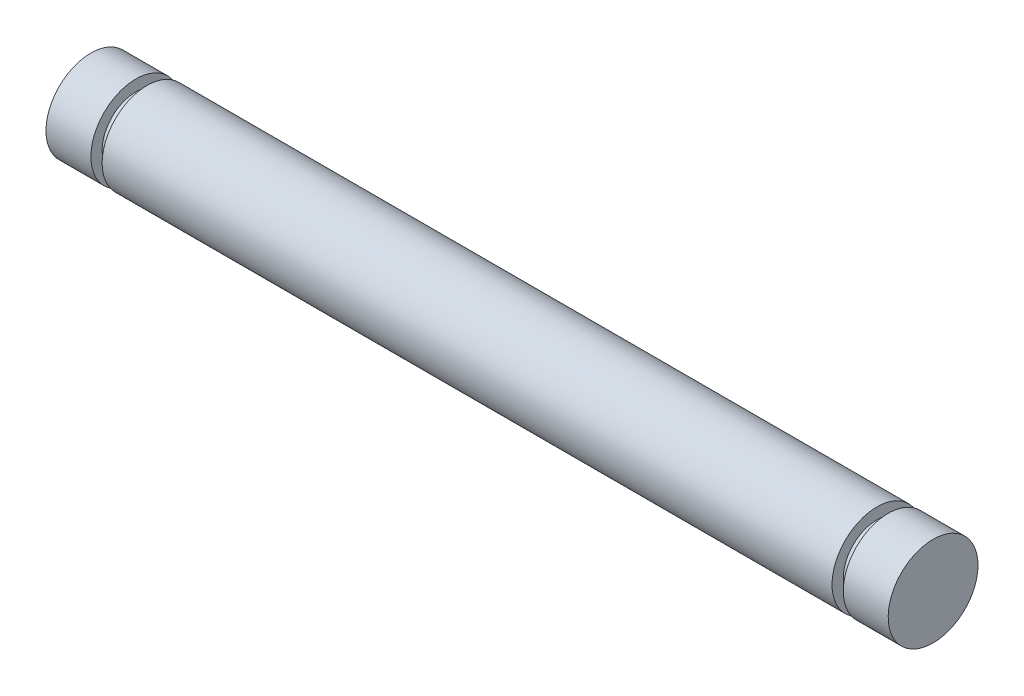
ISO-10303-21;
HEADER;
FILE_DESCRIPTION(('STEP AP214'),'2;1');
FILE_NAME('part.step','',(''),(''),'','','');
FILE_SCHEMA(('AUTOMOTIVE_DESIGN { 1 0 10303 214 1 1 1 1 }'));
ENDSEC;
DATA;
#1=APPLICATION_CONTEXT('core data for automotive mechanical design processes');
#2=APPLICATION_PROTOCOL_DEFINITION('international standard','automotive_design',2000,#1);
#3=PRODUCT_CONTEXT('',#1,'mechanical');
#4=PRODUCT('Part','Part','',(#3));
#5=PRODUCT_RELATED_PRODUCT_CATEGORY('part','',(#4));
#6=PRODUCT_DEFINITION_FORMATION('','',#4);
#7=PRODUCT_DEFINITION_CONTEXT('part definition',#1,'design');
#8=PRODUCT_DEFINITION('design','',#6,#7);
#9=PRODUCT_DEFINITION_SHAPE('','',#8);
#10=(LENGTH_UNIT() NAMED_UNIT(*) SI_UNIT(.MILLI.,.METRE.));
#11=(NAMED_UNIT(*) PLANE_ANGLE_UNIT() SI_UNIT($,.RADIAN.));
#12=(NAMED_UNIT(*) SI_UNIT($,.STERADIAN.) SOLID_ANGLE_UNIT());
#13=UNCERTAINTY_MEASURE_WITH_UNIT(LENGTH_MEASURE(1.E-05),#10,'distance_accuracy_value','');
#14=(GEOMETRIC_REPRESENTATION_CONTEXT(3) GLOBAL_UNCERTAINTY_ASSIGNED_CONTEXT((#13)) GLOBAL_UNIT_ASSIGNED_CONTEXT((#10,
#11,#12)) REPRESENTATION_CONTEXT('',''));
#15=CARTESIAN_POINT('',(0.,0.,0.));
#16=DIRECTION('',(0.,0.,1.));
#17=DIRECTION('',(1.,0.,0.));
#18=AXIS2_PLACEMENT_3D('',#15,#16,#17);
#19=CARTESIAN_POINT('',(-37.5,0.,0.));
#20=DIRECTION('',(1.,0.,0.));
#21=DIRECTION('',(0.,1.,0.));
#22=AXIS2_PLACEMENT_3D('',#19,#20,#21);
#23=PLANE('',#22);
#24=CARTESIAN_POINT('',(-37.5,0.,0.));
#25=DIRECTION('',(-1.,0.,0.));
#26=DIRECTION('',(0.,-1.,0.));
#27=AXIS2_PLACEMENT_3D('',#24,#25,#26);
#28=CIRCLE('',#27,4.);
#29=CARTESIAN_POINT('',(-37.5,-4.,0.));
#30=VERTEX_POINT('',#29);
#31=EDGE_CURVE('E10',#30,#30,#28,.T.);
#32=ORIENTED_EDGE('',*,*,#31,.T.);
#33=EDGE_LOOP('',(#32));
#34=FACE_BOUND('',#33,.T.);
#35=ADVANCED_FACE('F31',(#34),#23,.F.);
#36=CARTESIAN_POINT('',(-37.5,0.,0.));
#37=DIRECTION('',(-1.,0.,0.));
#38=DIRECTION('',(0.,-1.,0.));
#39=AXIS2_PLACEMENT_3D('',#36,#37,#38);
#40=CYLINDRICAL_SURFACE('',#39,4.);
#41=ORIENTED_EDGE('',*,*,#31,.F.);
#42=EDGE_LOOP('',(#41));
#43=FACE_BOUND('',#42,.T.);
#44=CARTESIAN_POINT('',(-33.5,0.,0.));
#45=DIRECTION('',(-1.,0.,0.));
#46=DIRECTION('',(0.,-1.,0.));
#47=AXIS2_PLACEMENT_3D('',#44,#45,#46);
#48=CIRCLE('',#47,4.);
#49=CARTESIAN_POINT('',(-33.5,-4.,0.));
#50=VERTEX_POINT('',#49);
#51=EDGE_CURVE('E37',#50,#50,#48,.T.);
#52=ORIENTED_EDGE('',*,*,#51,.T.);
#53=EDGE_LOOP('',(#52));
#54=FACE_BOUND('',#53,.T.);
#55=ADVANCED_FACE('F81',(#43,#54),#40,.T.);
#56=CARTESIAN_POINT('',(-33.5,4.,0.));
#57=DIRECTION('',(-1.,0.,0.));
#58=DIRECTION('',(0.,-1.,0.));
#59=AXIS2_PLACEMENT_3D('',#56,#57,#58);
#60=PLANE('',#59);
#61=ORIENTED_EDGE('',*,*,#51,.F.);
#62=EDGE_LOOP('',(#61));
#63=FACE_BOUND('',#62,.T.);
#64=CARTESIAN_POINT('',(-33.5,0.,0.));
#65=DIRECTION('',(-1.,0.,0.));
#66=DIRECTION('',(0.,-1.,0.));
#67=AXIS2_PLACEMENT_3D('',#64,#65,#66);
#68=CIRCLE('',#67,3.);
#69=CARTESIAN_POINT('',(-33.5,-3.,0.));
#70=VERTEX_POINT('',#69);
#71=EDGE_CURVE('E41',#70,#70,#68,.T.);
#72=ORIENTED_EDGE('',*,*,#71,.T.);
#73=EDGE_LOOP('',(#72));
#74=FACE_BOUND('',#73,.T.);
#75=ADVANCED_FACE('F85',(#63,#74),#60,.F.);
#76=CARTESIAN_POINT('',(-37.5,0.,0.));
#77=DIRECTION('',(-1.,0.,0.));
#78=DIRECTION('',(0.,-1.,0.));
#79=AXIS2_PLACEMENT_3D('',#76,#77,#78);
#80=CYLINDRICAL_SURFACE('',#79,3.);
#81=ORIENTED_EDGE('',*,*,#71,.F.);
#82=EDGE_LOOP('',(#81));
#83=FACE_BOUND('',#82,.T.);
#84=CARTESIAN_POINT('',(-32.5,0.,0.));
#85=DIRECTION('',(-1.,0.,0.));
#86=DIRECTION('',(0.,-1.,0.));
#87=AXIS2_PLACEMENT_3D('',#84,#85,#86);
#88=CIRCLE('',#87,3.);
#89=CARTESIAN_POINT('',(-32.5,-3.,0.));
#90=VERTEX_POINT('',#89);
#91=EDGE_CURVE('E45',#90,#90,#88,.T.);
#92=ORIENTED_EDGE('',*,*,#91,.T.);
#93=EDGE_LOOP('',(#92));
#94=FACE_BOUND('',#93,.T.);
#95=ADVANCED_FACE('F90',(#83,#94),#80,.T.);
#96=CARTESIAN_POINT('',(-32.5,3.,0.));
#97=DIRECTION('',(1.,0.,0.));
#98=DIRECTION('',(0.,1.,0.));
#99=AXIS2_PLACEMENT_3D('',#96,#97,#98);
#100=PLANE('',#99);
#101=ORIENTED_EDGE('',*,*,#91,.F.);
#102=EDGE_LOOP('',(#101));
#103=FACE_BOUND('',#102,.T.);
#104=CARTESIAN_POINT('',(-32.5,0.,0.));
#105=DIRECTION('',(-1.,0.,0.));
#106=DIRECTION('',(0.,-1.,0.));
#107=AXIS2_PLACEMENT_3D('',#104,#105,#106);
#108=CIRCLE('',#107,4.);
#109=CARTESIAN_POINT('',(-32.5,-4.,0.));
#110=VERTEX_POINT('',#109);
#111=EDGE_CURVE('E50',#110,#110,#108,.T.);
#112=ORIENTED_EDGE('',*,*,#111,.T.);
#113=EDGE_LOOP('',(#112));
#114=FACE_BOUND('',#113,.T.);
#115=ADVANCED_FACE('F96',(#103,#114),#100,.F.);
#116=CARTESIAN_POINT('',(-37.5,0.,0.));
#117=DIRECTION('',(-1.,0.,0.));
#118=DIRECTION('',(0.,-1.,0.));
#119=AXIS2_PLACEMENT_3D('',#116,#117,#118);
#120=CYLINDRICAL_SURFACE('',#119,3.99999999999999);
#121=ORIENTED_EDGE('',*,*,#111,.F.);
#122=EDGE_LOOP('',(#121));
#123=FACE_BOUND('',#122,.T.);
#124=CARTESIAN_POINT('',(32.5,0.,0.));
#125=DIRECTION('',(-1.,0.,0.));
#126=DIRECTION('',(0.,-1.,0.));
#127=AXIS2_PLACEMENT_3D('',#124,#125,#126);
#128=CIRCLE('',#127,3.99999999999999);
#129=CARTESIAN_POINT('',(32.5,-3.99999999999997,0.));
#130=VERTEX_POINT('',#129);
#131=EDGE_CURVE('E53',#130,#130,#128,.T.);
#132=ORIENTED_EDGE('',*,*,#131,.T.);
#133=EDGE_LOOP('',(#132));
#134=FACE_BOUND('',#133,.T.);
#135=ADVANCED_FACE('F100',(#123,#134),#120,.T.);
#136=CARTESIAN_POINT('',(32.5,4.,0.));
#137=DIRECTION('',(-1.,0.,0.));
#138=DIRECTION('',(0.,-1.,0.));
#139=AXIS2_PLACEMENT_3D('',#136,#137,#138);
#140=PLANE('',#139);
#141=ORIENTED_EDGE('',*,*,#131,.F.);
#142=EDGE_LOOP('',(#141));
#143=FACE_BOUND('',#142,.T.);
#144=CARTESIAN_POINT('',(32.5,0.,0.));
#145=DIRECTION('',(-1.,0.,0.));
#146=DIRECTION('',(0.,-1.,0.));
#147=AXIS2_PLACEMENT_3D('',#144,#145,#146);
#148=CIRCLE('',#147,2.99999999999999);
#149=CARTESIAN_POINT('',(32.5,-2.99999999999997,0.));
#150=VERTEX_POINT('',#149);
#151=EDGE_CURVE('E56',#150,#150,#148,.T.);
#152=ORIENTED_EDGE('',*,*,#151,.T.);
#153=EDGE_LOOP('',(#152));
#154=FACE_BOUND('',#153,.T.);
#155=ADVANCED_FACE('F104',(#143,#154),#140,.F.);
#156=CARTESIAN_POINT('',(-37.5,0.,0.));
#157=DIRECTION('',(-1.,0.,0.));
#158=DIRECTION('',(0.,-1.,0.));
#159=AXIS2_PLACEMENT_3D('',#156,#157,#158);
#160=CYLINDRICAL_SURFACE('',#159,2.99999999999999);
#161=ORIENTED_EDGE('',*,*,#151,.F.);
#162=EDGE_LOOP('',(#161));
#163=FACE_BOUND('',#162,.T.);
#164=CARTESIAN_POINT('',(33.5,0.,0.));
#165=DIRECTION('',(-1.,0.,0.));
#166=DIRECTION('',(0.,-1.,0.));
#167=AXIS2_PLACEMENT_3D('',#164,#165,#166);
#168=CIRCLE('',#167,3.);
#169=CARTESIAN_POINT('',(33.5,-2.99999999999999,0.));
#170=VERTEX_POINT('',#169);
#171=EDGE_CURVE('E59',#170,#170,#168,.T.);
#172=ORIENTED_EDGE('',*,*,#171,.T.);
#173=EDGE_LOOP('',(#172));
#174=FACE_BOUND('',#173,.T.);
#175=ADVANCED_FACE('F108',(#163,#174),#160,.T.);
#176=CARTESIAN_POINT('',(33.5,3.00000000000001,0.));
#177=DIRECTION('',(1.,0.,0.));
#178=DIRECTION('',(0.,1.,0.));
#179=AXIS2_PLACEMENT_3D('',#176,#177,#178);
#180=PLANE('',#179);
#181=ORIENTED_EDGE('',*,*,#171,.F.);
#182=EDGE_LOOP('',(#181));
#183=FACE_BOUND('',#182,.T.);
#184=CARTESIAN_POINT('',(33.5,0.,0.));
#185=DIRECTION('',(-1.,0.,0.));
#186=DIRECTION('',(0.,-1.,0.));
#187=AXIS2_PLACEMENT_3D('',#184,#185,#186);
#188=CIRCLE('',#187,4.);
#189=CARTESIAN_POINT('',(33.5,-3.99999999999999,0.));
#190=VERTEX_POINT('',#189);
#191=EDGE_CURVE('E62',#190,#190,#188,.T.);
#192=ORIENTED_EDGE('',*,*,#191,.T.);
#193=EDGE_LOOP('',(#192));
#194=FACE_BOUND('',#193,.T.);
#195=ADVANCED_FACE('F77',(#183,#194),#180,.F.);
#196=CARTESIAN_POINT('',(-37.5,0.,0.));
#197=DIRECTION('',(-1.,0.,0.));
#198=DIRECTION('',(0.,-1.,0.));
#199=AXIS2_PLACEMENT_3D('',#196,#197,#198);
#200=CYLINDRICAL_SURFACE('',#199,4.);
#201=ORIENTED_EDGE('',*,*,#191,.F.);
#202=EDGE_LOOP('',(#201));
#203=FACE_BOUND('',#202,.T.);
#204=CARTESIAN_POINT('',(37.5,0.,0.));
#205=DIRECTION('',(-1.,0.,0.));
#206=DIRECTION('',(0.,-1.,0.));
#207=AXIS2_PLACEMENT_3D('',#204,#205,#206);
#208=CIRCLE('',#207,4.);
#209=CARTESIAN_POINT('',(37.5,-3.99999999999999,0.));
#210=VERTEX_POINT('',#209);
#211=EDGE_CURVE('E65',#210,#210,#208,.T.);
#212=ORIENTED_EDGE('',*,*,#211,.T.);
#213=EDGE_LOOP('',(#212));
#214=FACE_BOUND('',#213,.T.);
#215=ADVANCED_FACE('F69',(#203,#214),#200,.T.);
#216=CARTESIAN_POINT('',(37.5,4.00000000000001,0.));
#217=DIRECTION('',(-1.,0.,0.));
#218=DIRECTION('',(0.,-1.,0.));
#219=AXIS2_PLACEMENT_3D('',#216,#217,#218);
#220=PLANE('',#219);
#221=ORIENTED_EDGE('',*,*,#211,.F.);
#222=EDGE_LOOP('',(#221));
#223=FACE_BOUND('',#222,.T.);
#224=ADVANCED_FACE('F71',(#223),#220,.F.);
#225=CLOSED_SHELL('',(#35,#55,#75,#95,#115,#135,#155,#175,#195,#215,#224));
#226=MANIFOLD_SOLID_BREP('B2',#225);
#227=ADVANCED_BREP_SHAPE_REPRESENTATION('',(#18,#226),#14);
#228=SHAPE_DEFINITION_REPRESENTATION(#9,#227);
ENDSEC;
END-ISO-10303-21;
